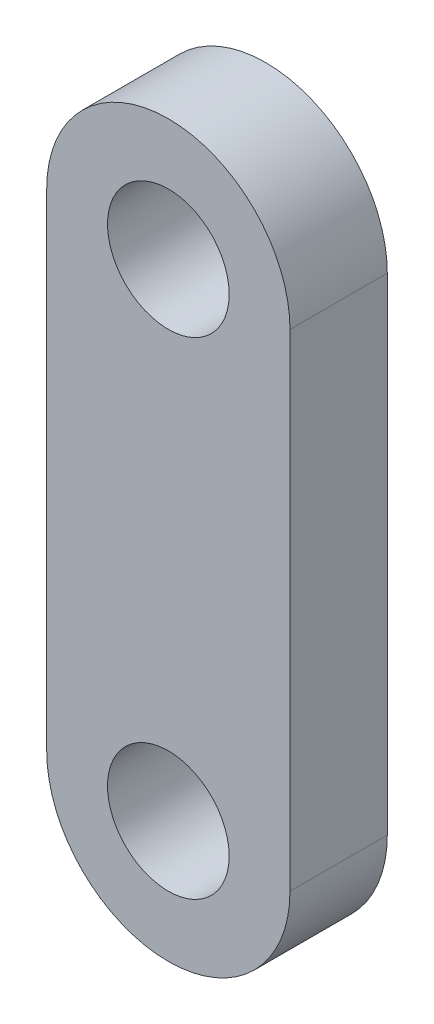
ISO-10303-21;
HEADER;
FILE_DESCRIPTION(('STEP AP214'),'2;1');
FILE_NAME('part.step','',(''),(''),'','','');
FILE_SCHEMA(('AUTOMOTIVE_DESIGN { 1 0 10303 214 1 1 1 1 }'));
ENDSEC;
DATA;
#1=APPLICATION_CONTEXT('core data for automotive mechanical design processes');
#2=APPLICATION_PROTOCOL_DEFINITION('international standard','automotive_design',2000,#1);
#3=PRODUCT_CONTEXT('',#1,'mechanical');
#4=PRODUCT('Part','Part','',(#3));
#5=PRODUCT_RELATED_PRODUCT_CATEGORY('part','',(#4));
#6=PRODUCT_DEFINITION_FORMATION('','',#4);
#7=PRODUCT_DEFINITION_CONTEXT('part definition',#1,'design');
#8=PRODUCT_DEFINITION('design','',#6,#7);
#9=PRODUCT_DEFINITION_SHAPE('','',#8);
#10=(LENGTH_UNIT() NAMED_UNIT(*) SI_UNIT(.MILLI.,.METRE.));
#11=(NAMED_UNIT(*) PLANE_ANGLE_UNIT() SI_UNIT($,.RADIAN.));
#12=(NAMED_UNIT(*) SI_UNIT($,.STERADIAN.) SOLID_ANGLE_UNIT());
#13=UNCERTAINTY_MEASURE_WITH_UNIT(LENGTH_MEASURE(1.E-05),#10,'distance_accuracy_value','');
#14=(GEOMETRIC_REPRESENTATION_CONTEXT(3) GLOBAL_UNCERTAINTY_ASSIGNED_CONTEXT((#13)) GLOBAL_UNIT_ASSIGNED_CONTEXT((#10,
#11,#12)) REPRESENTATION_CONTEXT('',''));
#15=CARTESIAN_POINT('',(0.,0.,0.));
#16=DIRECTION('',(0.,0.,1.));
#17=DIRECTION('',(1.,0.,0.));
#18=AXIS2_PLACEMENT_3D('',#15,#16,#17);
#19=CARTESIAN_POINT('',(9.99999999999979,0.,-8.));
#20=DIRECTION('',(1.,0.,0.));
#21=DIRECTION('',(0.,0.,-1.));
#22=AXIS2_PLACEMENT_3D('',#19,#20,#21);
#23=PLANE('',#22);
#24=DIRECTION('',(0.,1.,0.));
#25=VECTOR('',#24,1.);
#26=CARTESIAN_POINT('',(9.99999999999979,0.,0.));
#27=LINE('',#26,#25);
#28=CARTESIAN_POINT('',(9.99999999999979,0.,0.));
#29=VERTEX_POINT('',#28);
#30=CARTESIAN_POINT('',(9.99999999999989,40.,0.));
#31=VERTEX_POINT('',#30);
#32=EDGE_CURVE('E148',#29,#31,#27,.T.);
#33=ORIENTED_EDGE('',*,*,#32,.F.);
#34=DIRECTION('',(0.,0.,1.));
#35=VECTOR('',#34,1.);
#36=CARTESIAN_POINT('',(9.99999999999979,0.,-8.));
#37=LINE('',#36,#35);
#38=CARTESIAN_POINT('',(9.99999999999979,0.,-8.));
#39=VERTEX_POINT('',#38);
#40=EDGE_CURVE('E12',#39,#29,#37,.T.);
#41=ORIENTED_EDGE('',*,*,#40,.F.);
#42=DIRECTION('',(0.,1.,0.));
#43=VECTOR('',#42,1.);
#44=CARTESIAN_POINT('',(9.99999999999979,0.,-8.));
#45=LINE('',#44,#43);
#46=CARTESIAN_POINT('',(9.99999999999989,40.,-8.));
#47=VERTEX_POINT('',#46);
#48=EDGE_CURVE('E139',#39,#47,#45,.T.);
#49=ORIENTED_EDGE('',*,*,#48,.T.);
#50=DIRECTION('',(0.,0.,1.));
#51=VECTOR('',#50,1.);
#52=CARTESIAN_POINT('',(9.99999999999989,40.,-8.));
#53=LINE('',#52,#51);
#54=EDGE_CURVE('E80',#47,#31,#53,.T.);
#55=ORIENTED_EDGE('',*,*,#54,.T.);
#56=EDGE_LOOP('',(#33,#41,#49,#55));
#57=FACE_BOUND('',#56,.T.);
#58=ADVANCED_FACE('F77',(#57),#23,.T.);
#59=CARTESIAN_POINT('',(0.,0.,-8.));
#60=DIRECTION('',(0.,0.,1.));
#61=DIRECTION('',(1.,0.,0.));
#62=AXIS2_PLACEMENT_3D('',#59,#60,#61);
#63=CYLINDRICAL_SURFACE('',#62,9.99999999999979);
#64=CARTESIAN_POINT('',(0.,0.,0.));
#65=DIRECTION('',(0.,0.,1.));
#66=DIRECTION('',(1.,0.,0.));
#67=AXIS2_PLACEMENT_3D('',#64,#65,#66);
#68=CIRCLE('',#67,9.99999999999979);
#69=CARTESIAN_POINT('',(-9.99999999999979,0.,0.));
#70=VERTEX_POINT('',#69);
#71=EDGE_CURVE('E142',#70,#29,#68,.T.);
#72=ORIENTED_EDGE('',*,*,#71,.F.);
#73=DIRECTION('',(0.,0.,1.));
#74=VECTOR('',#73,1.);
#75=CARTESIAN_POINT('',(-9.99999999999979,0.,-8.));
#76=LINE('',#75,#74);
#77=CARTESIAN_POINT('',(-9.99999999999979,0.,-8.));
#78=VERTEX_POINT('',#77);
#79=EDGE_CURVE('E87',#78,#70,#76,.T.);
#80=ORIENTED_EDGE('',*,*,#79,.F.);
#81=CARTESIAN_POINT('',(0.,0.,-8.));
#82=DIRECTION('',(0.,0.,1.));
#83=DIRECTION('',(1.,0.,0.));
#84=AXIS2_PLACEMENT_3D('',#81,#82,#83);
#85=CIRCLE('',#84,9.99999999999979);
#86=EDGE_CURVE('E129',#78,#39,#85,.T.);
#87=ORIENTED_EDGE('',*,*,#86,.T.);
#88=ORIENTED_EDGE('',*,*,#40,.T.);
#89=EDGE_LOOP('',(#72,#80,#87,#88));
#90=FACE_BOUND('',#89,.T.);
#91=ADVANCED_FACE('F165',(#90),#63,.T.);
#92=CARTESIAN_POINT('',(-9.99999999999979,0.,-8.));
#93=DIRECTION('',(1.,0.,0.));
#94=DIRECTION('',(0.,0.,-1.));
#95=AXIS2_PLACEMENT_3D('',#92,#93,#94);
#96=PLANE('',#95);
#97=DIRECTION('',(0.,1.,0.));
#98=VECTOR('',#97,1.);
#99=CARTESIAN_POINT('',(-9.99999999999979,0.,0.));
#100=LINE('',#99,#98);
#101=CARTESIAN_POINT('',(-9.99999999999968,40.,0.));
#102=VERTEX_POINT('',#101);
#103=EDGE_CURVE('E134',#70,#102,#100,.T.);
#104=ORIENTED_EDGE('',*,*,#103,.T.);
#105=DIRECTION('',(0.,0.,1.));
#106=VECTOR('',#105,1.);
#107=CARTESIAN_POINT('',(-9.99999999999968,40.,-8.));
#108=LINE('',#107,#106);
#109=CARTESIAN_POINT('',(-9.99999999999968,40.,-8.));
#110=VERTEX_POINT('',#109);
#111=EDGE_CURVE('E132',#110,#102,#108,.T.);
#112=ORIENTED_EDGE('',*,*,#111,.F.);
#113=DIRECTION('',(0.,1.,0.));
#114=VECTOR('',#113,1.);
#115=CARTESIAN_POINT('',(-9.99999999999979,0.,-8.));
#116=LINE('',#115,#114);
#117=EDGE_CURVE('E125',#78,#110,#116,.T.);
#118=ORIENTED_EDGE('',*,*,#117,.F.);
#119=ORIENTED_EDGE('',*,*,#79,.T.);
#120=EDGE_LOOP('',(#104,#112,#118,#119));
#121=FACE_BOUND('',#120,.T.);
#122=ADVANCED_FACE('F133',(#121),#96,.F.);
#123=CARTESIAN_POINT('',(1.04083408558608E-13,40.,-8.));
#124=DIRECTION('',(0.,0.,1.));
#125=DIRECTION('',(1.,0.,0.));
#126=AXIS2_PLACEMENT_3D('',#123,#124,#125);
#127=CYLINDRICAL_SURFACE('',#126,9.99999999999979);
#128=CARTESIAN_POINT('',(1.04083408558608E-13,40.,0.));
#129=DIRECTION('',(0.,0.,1.));
#130=DIRECTION('',(1.,0.,0.));
#131=AXIS2_PLACEMENT_3D('',#128,#129,#130);
#132=CIRCLE('',#131,9.99999999999979);
#133=EDGE_CURVE('E152',#31,#102,#132,.T.);
#134=ORIENTED_EDGE('',*,*,#133,.F.);
#135=ORIENTED_EDGE('',*,*,#54,.F.);
#136=CARTESIAN_POINT('',(1.04083408558608E-13,40.,-8.));
#137=DIRECTION('',(0.,0.,1.));
#138=DIRECTION('',(1.,0.,0.));
#139=AXIS2_PLACEMENT_3D('',#136,#137,#138);
#140=CIRCLE('',#139,9.99999999999979);
#141=EDGE_CURVE('E128',#47,#110,#140,.T.);
#142=ORIENTED_EDGE('',*,*,#141,.T.);
#143=ORIENTED_EDGE('',*,*,#111,.T.);
#144=EDGE_LOOP('',(#134,#135,#142,#143));
#145=FACE_BOUND('',#144,.T.);
#146=ADVANCED_FACE('F137',(#145),#127,.T.);
#147=CARTESIAN_POINT('',(1.04083408558608E-13,40.,-8.));
#148=DIRECTION('',(0.,0.,1.));
#149=DIRECTION('',(1.,0.,0.));
#150=AXIS2_PLACEMENT_3D('',#147,#148,#149);
#151=PLANE('',#150);
#152=CARTESIAN_POINT('',(0.,0.,-8.));
#153=DIRECTION('',(0.,0.,1.));
#154=DIRECTION('',(1.,0.,0.));
#155=AXIS2_PLACEMENT_3D('',#152,#153,#154);
#156=CIRCLE('',#155,5.);
#157=CARTESIAN_POINT('',(5.,0.,-8.));
#158=VERTEX_POINT('',#157);
#159=EDGE_CURVE('E200',#158,#158,#156,.T.);
#160=ORIENTED_EDGE('',*,*,#159,.T.);
#161=EDGE_LOOP('',(#160));
#162=FACE_BOUND('',#161,.T.);
#163=CARTESIAN_POINT('',(1.04083408558608E-13,40.,-8.));
#164=DIRECTION('',(0.,0.,1.));
#165=DIRECTION('',(1.,0.,0.));
#166=AXIS2_PLACEMENT_3D('',#163,#164,#165);
#167=CIRCLE('',#166,5.);
#168=CARTESIAN_POINT('',(5.0000000000001,40.,-8.));
#169=VERTEX_POINT('',#168);
#170=EDGE_CURVE('E153',#169,#169,#167,.T.);
#171=ORIENTED_EDGE('',*,*,#170,.T.);
#172=EDGE_LOOP('',(#171));
#173=FACE_BOUND('',#172,.T.);
#174=ORIENTED_EDGE('',*,*,#48,.F.);
#175=ORIENTED_EDGE('',*,*,#86,.F.);
#176=ORIENTED_EDGE('',*,*,#117,.T.);
#177=ORIENTED_EDGE('',*,*,#141,.F.);
#178=EDGE_LOOP('',(#174,#175,#176,#177));
#179=FACE_BOUND('',#178,.T.);
#180=ADVANCED_FACE('F127',(#162,#173,#179),#151,.F.);
#181=CARTESIAN_POINT('',(1.04083408558608E-13,40.,0.));
#182=DIRECTION('',(0.,0.,1.));
#183=DIRECTION('',(1.,0.,0.));
#184=AXIS2_PLACEMENT_3D('',#181,#182,#183);
#185=PLANE('',#184);
#186=CARTESIAN_POINT('',(0.,0.,0.));
#187=DIRECTION('',(0.,0.,1.));
#188=DIRECTION('',(1.,0.,0.));
#189=AXIS2_PLACEMENT_3D('',#186,#187,#188);
#190=CIRCLE('',#189,5.);
#191=CARTESIAN_POINT('',(5.,0.,0.));
#192=VERTEX_POINT('',#191);
#193=EDGE_CURVE('E203',#192,#192,#190,.T.);
#194=ORIENTED_EDGE('',*,*,#193,.F.);
#195=EDGE_LOOP('',(#194));
#196=FACE_BOUND('',#195,.T.);
#197=CARTESIAN_POINT('',(1.04083408558608E-13,40.,0.));
#198=DIRECTION('',(0.,0.,1.));
#199=DIRECTION('',(1.,0.,0.));
#200=AXIS2_PLACEMENT_3D('',#197,#198,#199);
#201=CIRCLE('',#200,5.);
#202=CARTESIAN_POINT('',(5.0000000000001,40.,0.));
#203=VERTEX_POINT('',#202);
#204=EDGE_CURVE('E207',#203,#203,#201,.T.);
#205=ORIENTED_EDGE('',*,*,#204,.F.);
#206=EDGE_LOOP('',(#205));
#207=FACE_BOUND('',#206,.T.);
#208=ORIENTED_EDGE('',*,*,#32,.T.);
#209=ORIENTED_EDGE('',*,*,#133,.T.);
#210=ORIENTED_EDGE('',*,*,#103,.F.);
#211=ORIENTED_EDGE('',*,*,#71,.T.);
#212=EDGE_LOOP('',(#208,#209,#210,#211));
#213=FACE_BOUND('',#212,.T.);
#214=ADVANCED_FACE('F164',(#196,#207,#213),#185,.T.);
#215=CARTESIAN_POINT('',(1.04083408558608E-13,40.,-8.));
#216=DIRECTION('',(0.,0.,1.));
#217=DIRECTION('',(1.,0.,0.));
#218=AXIS2_PLACEMENT_3D('',#215,#216,#217);
#219=CYLINDRICAL_SURFACE('',#218,5.);
#220=ORIENTED_EDGE('',*,*,#170,.F.);
#221=EDGE_LOOP('',(#220));
#222=FACE_BOUND('',#221,.T.);
#223=ORIENTED_EDGE('',*,*,#204,.T.);
#224=EDGE_LOOP('',(#223));
#225=FACE_BOUND('',#224,.T.);
#226=ADVANCED_FACE('F184',(#222,#225),#219,.F.);
#227=CARTESIAN_POINT('',(0.,0.,-8.));
#228=DIRECTION('',(0.,0.,1.));
#229=DIRECTION('',(1.,0.,0.));
#230=AXIS2_PLACEMENT_3D('',#227,#228,#229);
#231=CYLINDRICAL_SURFACE('',#230,5.);
#232=ORIENTED_EDGE('',*,*,#159,.F.);
#233=EDGE_LOOP('',(#232));
#234=FACE_BOUND('',#233,.T.);
#235=ORIENTED_EDGE('',*,*,#193,.T.);
#236=EDGE_LOOP('',(#235));
#237=FACE_BOUND('',#236,.T.);
#238=ADVANCED_FACE('F191',(#234,#237),#231,.F.);
#239=CLOSED_SHELL('',(#58,#91,#122,#146,#180,#214,#226,#238));
#240=MANIFOLD_SOLID_BREP('B2',#239);
#241=ADVANCED_BREP_SHAPE_REPRESENTATION('',(#18,#240),#14);
#242=SHAPE_DEFINITION_REPRESENTATION(#9,#241);
ENDSEC;
END-ISO-10303-21;
